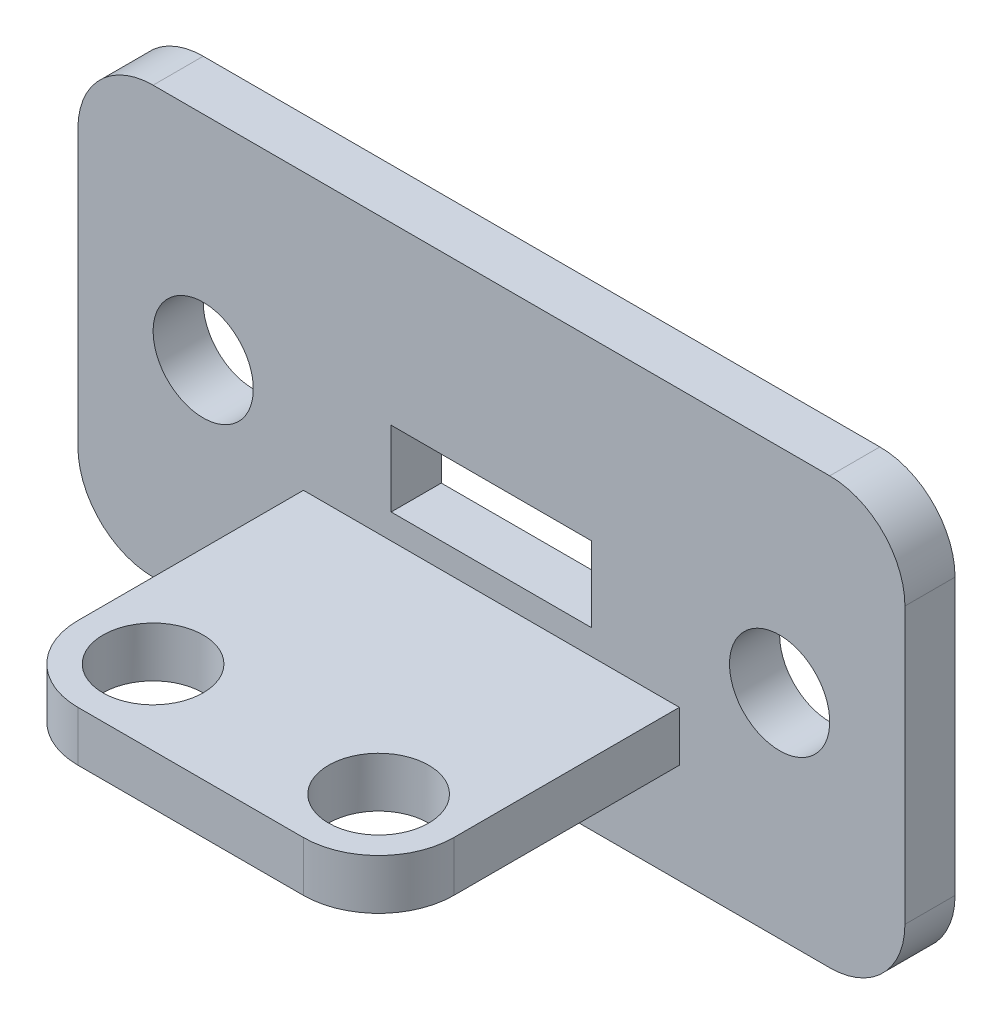
ISO-10303-21;
HEADER;
FILE_DESCRIPTION(('STEP AP214'),'2;1');
FILE_NAME('part.step','',(''),(''),'','','');
FILE_SCHEMA(('AUTOMOTIVE_DESIGN { 1 0 10303 214 1 1 1 1 }'));
ENDSEC;
DATA;
#1=APPLICATION_CONTEXT('core data for automotive mechanical design processes');
#2=APPLICATION_PROTOCOL_DEFINITION('international standard','automotive_design',2000,#1);
#3=PRODUCT_CONTEXT('',#1,'mechanical');
#4=PRODUCT('Part','Part','',(#3));
#5=PRODUCT_RELATED_PRODUCT_CATEGORY('part','',(#4));
#6=PRODUCT_DEFINITION_FORMATION('','',#4);
#7=PRODUCT_DEFINITION_CONTEXT('part definition',#1,'design');
#8=PRODUCT_DEFINITION('design','',#6,#7);
#9=PRODUCT_DEFINITION_SHAPE('','',#8);
#10=(LENGTH_UNIT() NAMED_UNIT(*) SI_UNIT(.MILLI.,.METRE.));
#11=(NAMED_UNIT(*) PLANE_ANGLE_UNIT() SI_UNIT($,.RADIAN.));
#12=(NAMED_UNIT(*) SI_UNIT($,.STERADIAN.) SOLID_ANGLE_UNIT());
#13=UNCERTAINTY_MEASURE_WITH_UNIT(LENGTH_MEASURE(1.E-05),#10,'distance_accuracy_value','');
#14=(GEOMETRIC_REPRESENTATION_CONTEXT(3) GLOBAL_UNCERTAINTY_ASSIGNED_CONTEXT((#13)) GLOBAL_UNIT_ASSIGNED_CONTEXT((#10,
#11,#12)) REPRESENTATION_CONTEXT('',''));
#15=CARTESIAN_POINT('',(0.,0.,0.));
#16=DIRECTION('',(0.,0.,1.));
#17=DIRECTION('',(1.,0.,0.));
#18=AXIS2_PLACEMENT_3D('',#15,#16,#17);
#19=CARTESIAN_POINT('',(7.5,2.,6.));
#20=DIRECTION('',(-1.,0.,0.));
#21=DIRECTION('',(0.,0.,1.));
#22=AXIS2_PLACEMENT_3D('',#19,#20,#21);
#23=PLANE('',#22);
#24=DIRECTION('',(0.,0.,-1.));
#25=VECTOR('',#24,1.);
#26=CARTESIAN_POINT('',(7.5,2.,6.));
#27=LINE('',#26,#25);
#28=CARTESIAN_POINT('',(7.5,2.,3.));
#29=VERTEX_POINT('',#28);
#30=CARTESIAN_POINT('',(7.5,2.,-6.));
#31=VERTEX_POINT('',#30);
#32=EDGE_CURVE('E239',#29,#31,#27,.T.);
#33=ORIENTED_EDGE('',*,*,#32,.F.);
#34=DIRECTION('',(0.,-1.,0.));
#35=VECTOR('',#34,1.);
#36=CARTESIAN_POINT('',(7.5,2.,3.));
#37=LINE('',#36,#35);
#38=CARTESIAN_POINT('',(7.5,0.,3.));
#39=VERTEX_POINT('',#38);
#40=EDGE_CURVE('E11',#29,#39,#37,.T.);
#41=ORIENTED_EDGE('',*,*,#40,.T.);
#42=DIRECTION('',(0.,0.,-1.));
#43=VECTOR('',#42,1.);
#44=CARTESIAN_POINT('',(7.5,0.,6.));
#45=LINE('',#44,#43);
#46=CARTESIAN_POINT('',(7.5,0.,-6.));
#47=VERTEX_POINT('',#46);
#48=EDGE_CURVE('E230',#39,#47,#45,.T.);
#49=ORIENTED_EDGE('',*,*,#48,.T.);
#50=DIRECTION('',(0.,-1.,0.));
#51=VECTOR('',#50,1.);
#52=CARTESIAN_POINT('',(7.5,2.,-6.));
#53=LINE('',#52,#51);
#54=EDGE_CURVE('E258',#31,#47,#53,.T.);
#55=ORIENTED_EDGE('',*,*,#54,.F.);
#56=EDGE_LOOP('',(#33,#41,#49,#55));
#57=FACE_BOUND('',#56,.T.);
#58=ADVANCED_FACE('F32',(#57),#23,.F.);
#59=CARTESIAN_POINT('',(-7.5,2.,6.));
#60=DIRECTION('',(1.,0.,0.));
#61=DIRECTION('',(0.,0.,-1.));
#62=AXIS2_PLACEMENT_3D('',#59,#60,#61);
#63=PLANE('',#62);
#64=DIRECTION('',(0.,0.,1.));
#65=VECTOR('',#64,1.);
#66=CARTESIAN_POINT('',(-7.5,0.,6.));
#67=LINE('',#66,#65);
#68=CARTESIAN_POINT('',(-7.5,0.,-6.));
#69=VERTEX_POINT('',#68);
#70=CARTESIAN_POINT('',(-7.5,0.,3.));
#71=VERTEX_POINT('',#70);
#72=EDGE_CURVE('E253',#69,#71,#67,.T.);
#73=ORIENTED_EDGE('',*,*,#72,.T.);
#74=DIRECTION('',(0.,-1.,0.));
#75=VECTOR('',#74,1.);
#76=CARTESIAN_POINT('',(-7.5,2.,3.));
#77=LINE('',#76,#75);
#78=CARTESIAN_POINT('',(-7.5,2.,3.));
#79=VERTEX_POINT('',#78);
#80=EDGE_CURVE('E55',#71,#79,#77,.F.);
#81=ORIENTED_EDGE('',*,*,#80,.T.);
#82=DIRECTION('',(0.,0.,1.));
#83=VECTOR('',#82,1.);
#84=CARTESIAN_POINT('',(-7.5,2.,6.));
#85=LINE('',#84,#83);
#86=CARTESIAN_POINT('',(-7.5,2.,-6.));
#87=VERTEX_POINT('',#86);
#88=EDGE_CURVE('E244',#87,#79,#85,.T.);
#89=ORIENTED_EDGE('',*,*,#88,.F.);
#90=DIRECTION('',(0.,-1.,0.));
#91=VECTOR('',#90,1.);
#92=CARTESIAN_POINT('',(-7.5,2.,-6.));
#93=LINE('',#92,#91);
#94=EDGE_CURVE('E248',#87,#69,#93,.T.);
#95=ORIENTED_EDGE('',*,*,#94,.T.);
#96=EDGE_LOOP('',(#73,#81,#89,#95));
#97=FACE_BOUND('',#96,.T.);
#98=ADVANCED_FACE('F321',(#97),#63,.F.);
#99=CARTESIAN_POINT('',(-7.5,2.,6.));
#100=DIRECTION('',(0.,0.,-1.));
#101=DIRECTION('',(-1.,0.,0.));
#102=AXIS2_PLACEMENT_3D('',#99,#100,#101);
#103=PLANE('',#102);
#104=DIRECTION('',(1.,0.,0.));
#105=VECTOR('',#104,1.);
#106=CARTESIAN_POINT('',(-7.5,2.,6.));
#107=LINE('',#106,#105);
#108=CARTESIAN_POINT('',(-4.5,2.,6.));
#109=VERTEX_POINT('',#108);
#110=CARTESIAN_POINT('',(4.5,2.,6.));
#111=VERTEX_POINT('',#110);
#112=EDGE_CURVE('E246',#109,#111,#107,.T.);
#113=ORIENTED_EDGE('',*,*,#112,.F.);
#114=DIRECTION('',(0.,-1.,0.));
#115=VECTOR('',#114,1.);
#116=CARTESIAN_POINT('',(-4.5,2.,6.));
#117=LINE('',#116,#115);
#118=CARTESIAN_POINT('',(-4.5,0.,6.));
#119=VERTEX_POINT('',#118);
#120=EDGE_CURVE('E299',#109,#119,#117,.T.);
#121=ORIENTED_EDGE('',*,*,#120,.T.);
#122=DIRECTION('',(1.,0.,0.));
#123=VECTOR('',#122,1.);
#124=CARTESIAN_POINT('',(-7.5,0.,6.));
#125=LINE('',#124,#123);
#126=CARTESIAN_POINT('',(4.5,0.,6.));
#127=VERTEX_POINT('',#126);
#128=EDGE_CURVE('E242',#119,#127,#125,.T.);
#129=ORIENTED_EDGE('',*,*,#128,.T.);
#130=DIRECTION('',(0.,-1.,0.));
#131=VECTOR('',#130,1.);
#132=CARTESIAN_POINT('',(4.5,2.,6.));
#133=LINE('',#132,#131);
#134=EDGE_CURVE('E297',#127,#111,#133,.F.);
#135=ORIENTED_EDGE('',*,*,#134,.T.);
#136=EDGE_LOOP('',(#113,#121,#129,#135));
#137=FACE_BOUND('',#136,.T.);
#138=ADVANCED_FACE('F313',(#137),#103,.F.);
#139=CARTESIAN_POINT('',(0.,2.,0.));
#140=DIRECTION('',(0.,-1.,0.));
#141=DIRECTION('',(0.,0.,-1.));
#142=AXIS2_PLACEMENT_3D('',#139,#140,#141);
#143=PLANE('',#142);
#144=CARTESIAN_POINT('',(-4.5,2.,3.));
#145=DIRECTION('',(0.,1.,0.));
#146=DIRECTION('',(0.,0.,1.));
#147=AXIS2_PLACEMENT_3D('',#144,#145,#146);
#148=CIRCLE('',#147,2.);
#149=CARTESIAN_POINT('',(-4.5,2.,5.));
#150=VERTEX_POINT('',#149);
#151=EDGE_CURVE('E227',#150,#150,#148,.T.);
#152=ORIENTED_EDGE('',*,*,#151,.F.);
#153=EDGE_LOOP('',(#152));
#154=FACE_BOUND('',#153,.T.);
#155=CARTESIAN_POINT('',(4.5,2.,3.));
#156=DIRECTION('',(0.,1.,0.));
#157=DIRECTION('',(0.,0.,1.));
#158=AXIS2_PLACEMENT_3D('',#155,#156,#157);
#159=CIRCLE('',#158,2.);
#160=CARTESIAN_POINT('',(4.5,2.,5.));
#161=VERTEX_POINT('',#160);
#162=EDGE_CURVE('E234',#161,#161,#159,.T.);
#163=ORIENTED_EDGE('',*,*,#162,.F.);
#164=EDGE_LOOP('',(#163));
#165=FACE_BOUND('',#164,.T.);
#166=ORIENTED_EDGE('',*,*,#88,.T.);
#167=CARTESIAN_POINT('',(-4.5,2.,3.));
#168=DIRECTION('',(0.,-1.,0.));
#169=DIRECTION('',(0.,0.,-1.));
#170=AXIS2_PLACEMENT_3D('',#167,#168,#169);
#171=CIRCLE('',#170,3.);
#172=EDGE_CURVE('E40',#79,#109,#171,.F.);
#173=ORIENTED_EDGE('',*,*,#172,.T.);
#174=ORIENTED_EDGE('',*,*,#112,.T.);
#175=CARTESIAN_POINT('',(4.5,2.,3.));
#176=DIRECTION('',(0.,-1.,0.));
#177=DIRECTION('',(0.,0.,-1.));
#178=AXIS2_PLACEMENT_3D('',#175,#176,#177);
#179=CIRCLE('',#178,3.);
#180=EDGE_CURVE('E47',#111,#29,#179,.F.);
#181=ORIENTED_EDGE('',*,*,#180,.T.);
#182=ORIENTED_EDGE('',*,*,#32,.T.);
#183=DIRECTION('',(-1.,0.,0.));
#184=VECTOR('',#183,1.);
#185=CARTESIAN_POINT('',(-7.5,2.,-6.));
#186=LINE('',#185,#184);
#187=EDGE_CURVE('E241',#31,#87,#186,.T.);
#188=ORIENTED_EDGE('',*,*,#187,.T.);
#189=EDGE_LOOP('',(#166,#173,#174,#181,#182,#188));
#190=FACE_BOUND('',#189,.T.);
#191=ADVANCED_FACE('F309',(#154,#165,#190),#143,.F.);
#192=CARTESIAN_POINT('',(0.,0.,0.));
#193=DIRECTION('',(0.,-1.,0.));
#194=DIRECTION('',(0.,0.,-1.));
#195=AXIS2_PLACEMENT_3D('',#192,#193,#194);
#196=PLANE('',#195);
#197=CARTESIAN_POINT('',(-4.5,0.,3.));
#198=DIRECTION('',(0.,-1.,0.));
#199=DIRECTION('',(0.,0.,-1.));
#200=AXIS2_PLACEMENT_3D('',#197,#198,#199);
#201=CIRCLE('',#200,2.);
#202=CARTESIAN_POINT('',(-4.5,0.,0.999999999999998));
#203=VERTEX_POINT('',#202);
#204=EDGE_CURVE('E231',#203,#203,#201,.F.);
#205=ORIENTED_EDGE('',*,*,#204,.T.);
#206=EDGE_LOOP('',(#205));
#207=FACE_BOUND('',#206,.T.);
#208=CARTESIAN_POINT('',(4.5,0.,3.));
#209=DIRECTION('',(0.,-1.,0.));
#210=DIRECTION('',(0.,0.,-1.));
#211=AXIS2_PLACEMENT_3D('',#208,#209,#210);
#212=CIRCLE('',#211,2.);
#213=CARTESIAN_POINT('',(4.5,0.,0.999999999999998));
#214=VERTEX_POINT('',#213);
#215=EDGE_CURVE('E216',#214,#214,#212,.F.);
#216=ORIENTED_EDGE('',*,*,#215,.T.);
#217=EDGE_LOOP('',(#216));
#218=FACE_BOUND('',#217,.T.);
#219=ORIENTED_EDGE('',*,*,#128,.F.);
#220=CARTESIAN_POINT('',(-4.5,0.,3.));
#221=DIRECTION('',(0.,-1.,0.));
#222=DIRECTION('',(0.,0.,-1.));
#223=AXIS2_PLACEMENT_3D('',#220,#221,#222);
#224=CIRCLE('',#223,3.);
#225=EDGE_CURVE('E304',#119,#71,#224,.T.);
#226=ORIENTED_EDGE('',*,*,#225,.T.);
#227=ORIENTED_EDGE('',*,*,#72,.F.);
#228=DIRECTION('',(-1.,0.,0.));
#229=VECTOR('',#228,1.);
#230=CARTESIAN_POINT('',(-7.5,0.,-6.));
#231=LINE('',#230,#229);
#232=EDGE_CURVE('E250',#47,#69,#231,.T.);
#233=ORIENTED_EDGE('',*,*,#232,.F.);
#234=ORIENTED_EDGE('',*,*,#48,.F.);
#235=CARTESIAN_POINT('',(4.5,0.,3.));
#236=DIRECTION('',(0.,-1.,0.));
#237=DIRECTION('',(0.,0.,-1.));
#238=AXIS2_PLACEMENT_3D('',#235,#236,#237);
#239=CIRCLE('',#238,3.);
#240=EDGE_CURVE('E302',#39,#127,#239,.T.);
#241=ORIENTED_EDGE('',*,*,#240,.T.);
#242=EDGE_LOOP('',(#219,#226,#227,#233,#234,#241));
#243=FACE_BOUND('',#242,.T.);
#244=ADVANCED_FACE('F319',(#207,#218,#243),#196,.T.);
#245=CARTESIAN_POINT('',(4.5,-0.00100000000000013,3.));
#246=DIRECTION('',(0.,1.,0.));
#247=DIRECTION('',(0.,0.,1.));
#248=AXIS2_PLACEMENT_3D('',#245,#246,#247);
#249=CYLINDRICAL_SURFACE('',#248,2.);
#250=ORIENTED_EDGE('',*,*,#215,.F.);
#251=EDGE_LOOP('',(#250));
#252=FACE_BOUND('',#251,.T.);
#253=ORIENTED_EDGE('',*,*,#162,.T.);
#254=EDGE_LOOP('',(#253));
#255=FACE_BOUND('',#254,.T.);
#256=ADVANCED_FACE('F399',(#252,#255),#249,.F.);
#257=CARTESIAN_POINT('',(-4.5,-0.00100000000000013,3.));
#258=DIRECTION('',(0.,1.,0.));
#259=DIRECTION('',(0.,0.,1.));
#260=AXIS2_PLACEMENT_3D('',#257,#258,#259);
#261=CYLINDRICAL_SURFACE('',#260,2.);
#262=ORIENTED_EDGE('',*,*,#204,.F.);
#263=EDGE_LOOP('',(#262));
#264=FACE_BOUND('',#263,.T.);
#265=ORIENTED_EDGE('',*,*,#151,.T.);
#266=EDGE_LOOP('',(#265));
#267=FACE_BOUND('',#266,.T.);
#268=ADVANCED_FACE('F391',(#264,#267),#261,.F.);
#269=CARTESIAN_POINT('',(0.,0.,-6.));
#270=DIRECTION('',(0.,0.,-1.));
#271=DIRECTION('',(-1.,0.,0.));
#272=AXIS2_PLACEMENT_3D('',#269,#270,#271);
#273=PLANE('',#272);
#274=CARTESIAN_POINT('',(11.5,4.5,-6.));
#275=DIRECTION('',(0.,0.,-1.));
#276=DIRECTION('',(-1.,0.,0.));
#277=AXIS2_PLACEMENT_3D('',#274,#275,#276);
#278=CIRCLE('',#277,2.);
#279=CARTESIAN_POINT('',(9.5,4.5,-6.));
#280=VERTEX_POINT('',#279);
#281=EDGE_CURVE('E596',#280,#280,#278,.F.);
#282=ORIENTED_EDGE('',*,*,#281,.F.);
#283=EDGE_LOOP('',(#282));
#284=FACE_BOUND('',#283,.T.);
#285=CARTESIAN_POINT('',(-11.5,4.5,-6.));
#286=DIRECTION('',(0.,0.,-1.));
#287=DIRECTION('',(-1.,0.,0.));
#288=AXIS2_PLACEMENT_3D('',#285,#286,#287);
#289=CIRCLE('',#288,2.);
#290=CARTESIAN_POINT('',(-13.5,4.5,-6.));
#291=VERTEX_POINT('',#290);
#292=EDGE_CURVE('E591',#291,#291,#289,.F.);
#293=ORIENTED_EDGE('',*,*,#292,.F.);
#294=EDGE_LOOP('',(#293));
#295=FACE_BOUND('',#294,.T.);
#296=DIRECTION('',(-1.,0.,0.));
#297=VECTOR('',#296,1.);
#298=CARTESIAN_POINT('',(-4.,6.,-6.));
#299=LINE('',#298,#297);
#300=CARTESIAN_POINT('',(4.,6.,-6.));
#301=VERTEX_POINT('',#300);
#302=CARTESIAN_POINT('',(-4.,6.,-6.));
#303=VERTEX_POINT('',#302);
#304=EDGE_CURVE('E187',#301,#303,#299,.T.);
#305=ORIENTED_EDGE('',*,*,#304,.F.);
#306=DIRECTION('',(0.,1.,0.));
#307=VECTOR('',#306,1.);
#308=CARTESIAN_POINT('',(4.,3.,-6.));
#309=LINE('',#308,#307);
#310=CARTESIAN_POINT('',(4.,3.,-6.));
#311=VERTEX_POINT('',#310);
#312=EDGE_CURVE('E179',#311,#301,#309,.T.);
#313=ORIENTED_EDGE('',*,*,#312,.F.);
#314=DIRECTION('',(1.,0.,0.));
#315=VECTOR('',#314,1.);
#316=CARTESIAN_POINT('',(-4.,3.,-6.));
#317=LINE('',#316,#315);
#318=CARTESIAN_POINT('',(-4.,3.,-6.));
#319=VERTEX_POINT('',#318);
#320=EDGE_CURVE('E180',#319,#311,#317,.T.);
#321=ORIENTED_EDGE('',*,*,#320,.F.);
#322=DIRECTION('',(0.,-1.,0.));
#323=VECTOR('',#322,1.);
#324=CARTESIAN_POINT('',(-4.,3.,-6.));
#325=LINE('',#324,#323);
#326=EDGE_CURVE('E194',#303,#319,#325,.T.);
#327=ORIENTED_EDGE('',*,*,#326,.F.);
#328=EDGE_LOOP('',(#305,#313,#321,#327));
#329=FACE_BOUND('',#328,.T.);
#330=DIRECTION('',(-1.,0.,0.));
#331=VECTOR('',#330,1.);
#332=CARTESIAN_POINT('',(16.5,-4.,-6.));
#333=LINE('',#332,#331);
#334=CARTESIAN_POINT('',(13.5,-4.,-6.));
#335=VERTEX_POINT('',#334);
#336=CARTESIAN_POINT('',(-13.5,-4.,-6.));
#337=VERTEX_POINT('',#336);
#338=EDGE_CURVE('E219',#335,#337,#333,.T.);
#339=ORIENTED_EDGE('',*,*,#338,.F.);
#340=CARTESIAN_POINT('',(13.5,-1.,-6.));
#341=DIRECTION('',(0.,0.,-1.));
#342=DIRECTION('',(-1.,0.,0.));
#343=AXIS2_PLACEMENT_3D('',#340,#341,#342);
#344=CIRCLE('',#343,3.);
#345=CARTESIAN_POINT('',(16.5,-0.999999999999999,-6.));
#346=VERTEX_POINT('',#345);
#347=EDGE_CURVE('E272',#335,#346,#344,.F.);
#348=ORIENTED_EDGE('',*,*,#347,.T.);
#349=DIRECTION('',(0.,-1.,0.));
#350=VECTOR('',#349,1.);
#351=CARTESIAN_POINT('',(16.5,13.,-6.));
#352=LINE('',#351,#350);
#353=CARTESIAN_POINT('',(16.5,10.,-6.));
#354=VERTEX_POINT('',#353);
#355=EDGE_CURVE('E171',#354,#346,#352,.T.);
#356=ORIENTED_EDGE('',*,*,#355,.F.);
#357=CARTESIAN_POINT('',(13.5,10.,-6.));
#358=DIRECTION('',(0.,0.,-1.));
#359=DIRECTION('',(-1.,0.,0.));
#360=AXIS2_PLACEMENT_3D('',#357,#358,#359);
#361=CIRCLE('',#360,3.);
#362=CARTESIAN_POINT('',(13.5,13.,-6.));
#363=VERTEX_POINT('',#362);
#364=EDGE_CURVE('E266',#354,#363,#361,.F.);
#365=ORIENTED_EDGE('',*,*,#364,.T.);
#366=DIRECTION('',(1.,0.,0.));
#367=VECTOR('',#366,1.);
#368=CARTESIAN_POINT('',(16.5,13.,-6.));
#369=LINE('',#368,#367);
#370=CARTESIAN_POINT('',(-13.5,13.,-6.));
#371=VERTEX_POINT('',#370);
#372=EDGE_CURVE('E207',#371,#363,#369,.T.);
#373=ORIENTED_EDGE('',*,*,#372,.F.);
#374=CARTESIAN_POINT('',(-13.5,10.,-6.));
#375=DIRECTION('',(0.,0.,-1.));
#376=DIRECTION('',(-1.,0.,0.));
#377=AXIS2_PLACEMENT_3D('',#374,#375,#376);
#378=CIRCLE('',#377,3.);
#379=CARTESIAN_POINT('',(-16.5,10.,-6.));
#380=VERTEX_POINT('',#379);
#381=EDGE_CURVE('E268',#371,#380,#378,.F.);
#382=ORIENTED_EDGE('',*,*,#381,.T.);
#383=DIRECTION('',(0.,1.,0.));
#384=VECTOR('',#383,1.);
#385=CARTESIAN_POINT('',(-16.5,13.,-6.));
#386=LINE('',#385,#384);
#387=CARTESIAN_POINT('',(-16.5,-1.,-6.));
#388=VERTEX_POINT('',#387);
#389=EDGE_CURVE('E222',#388,#380,#386,.T.);
#390=ORIENTED_EDGE('',*,*,#389,.F.);
#391=CARTESIAN_POINT('',(-13.5,-1.,-6.));
#392=DIRECTION('',(0.,0.,-1.));
#393=DIRECTION('',(-1.,0.,0.));
#394=AXIS2_PLACEMENT_3D('',#391,#392,#393);
#395=CIRCLE('',#394,3.);
#396=EDGE_CURVE('E270',#388,#337,#395,.F.);
#397=ORIENTED_EDGE('',*,*,#396,.T.);
#398=EDGE_LOOP('',(#339,#348,#356,#365,#373,#382,#390,#397));
#399=FACE_BOUND('',#398,.T.);
#400=ORIENTED_EDGE('',*,*,#54,.T.);
#401=ORIENTED_EDGE('',*,*,#232,.T.);
#402=ORIENTED_EDGE('',*,*,#94,.F.);
#403=ORIENTED_EDGE('',*,*,#187,.F.);
#404=EDGE_LOOP('',(#400,#401,#402,#403));
#405=FACE_BOUND('',#404,.T.);
#406=ADVANCED_FACE('F325',(#284,#295,#329,#399,#405),#273,.F.);
#407=CARTESIAN_POINT('',(16.5,13.,-8.));
#408=DIRECTION('',(-1.,0.,0.));
#409=DIRECTION('',(0.,-1.,0.));
#410=AXIS2_PLACEMENT_3D('',#407,#408,#409);
#411=PLANE('',#410);
#412=ORIENTED_EDGE('',*,*,#355,.T.);
#413=DIRECTION('',(0.,0.,1.));
#414=VECTOR('',#413,1.);
#415=CARTESIAN_POINT('',(16.5,-0.999999999999999,-8.));
#416=LINE('',#415,#414);
#417=CARTESIAN_POINT('',(16.5,-0.999999999999999,-8.));
#418=VERTEX_POINT('',#417);
#419=EDGE_CURVE('E277',#346,#418,#416,.F.);
#420=ORIENTED_EDGE('',*,*,#419,.T.);
#421=DIRECTION('',(0.,-1.,0.));
#422=VECTOR('',#421,1.);
#423=CARTESIAN_POINT('',(16.5,13.,-8.));
#424=LINE('',#423,#422);
#425=CARTESIAN_POINT('',(16.5,10.,-8.));
#426=VERTEX_POINT('',#425);
#427=EDGE_CURVE('E203',#426,#418,#424,.T.);
#428=ORIENTED_EDGE('',*,*,#427,.F.);
#429=DIRECTION('',(0.,0.,1.));
#430=VECTOR('',#429,1.);
#431=CARTESIAN_POINT('',(16.5,10.,-8.));
#432=LINE('',#431,#430);
#433=EDGE_CURVE('E274',#426,#354,#432,.T.);
#434=ORIENTED_EDGE('',*,*,#433,.T.);
#435=EDGE_LOOP('',(#412,#420,#428,#434));
#436=FACE_BOUND('',#435,.T.);
#437=ADVANCED_FACE('F368',(#436),#411,.F.);
#438=CARTESIAN_POINT('',(16.5,-4.,-8.));
#439=DIRECTION('',(0.,1.,0.));
#440=DIRECTION('',(0.,0.,1.));
#441=AXIS2_PLACEMENT_3D('',#438,#439,#440);
#442=PLANE('',#441);
#443=DIRECTION('',(-1.,0.,0.));
#444=VECTOR('',#443,1.);
#445=CARTESIAN_POINT('',(16.5,-4.,-8.));
#446=LINE('',#445,#444);
#447=CARTESIAN_POINT('',(13.5,-4.,-8.));
#448=VERTEX_POINT('',#447);
#449=CARTESIAN_POINT('',(-13.5,-4.,-8.));
#450=VERTEX_POINT('',#449);
#451=EDGE_CURVE('E206',#448,#450,#446,.T.);
#452=ORIENTED_EDGE('',*,*,#451,.F.);
#453=DIRECTION('',(0.,0.,1.));
#454=VECTOR('',#453,1.);
#455=CARTESIAN_POINT('',(13.5,-4.,-8.));
#456=LINE('',#455,#454);
#457=EDGE_CURVE('E263',#448,#335,#456,.T.);
#458=ORIENTED_EDGE('',*,*,#457,.T.);
#459=ORIENTED_EDGE('',*,*,#338,.T.);
#460=DIRECTION('',(0.,0.,1.));
#461=VECTOR('',#460,1.);
#462=CARTESIAN_POINT('',(-13.5,-4.,-8.));
#463=LINE('',#462,#461);
#464=EDGE_CURVE('E261',#337,#450,#463,.F.);
#465=ORIENTED_EDGE('',*,*,#464,.T.);
#466=EDGE_LOOP('',(#452,#458,#459,#465));
#467=FACE_BOUND('',#466,.T.);
#468=ADVANCED_FACE('F375',(#467),#442,.F.);
#469=CARTESIAN_POINT('',(-16.5,13.,-8.));
#470=DIRECTION('',(1.,0.,0.));
#471=DIRECTION('',(0.,1.,0.));
#472=AXIS2_PLACEMENT_3D('',#469,#470,#471);
#473=PLANE('',#472);
#474=DIRECTION('',(0.,1.,0.));
#475=VECTOR('',#474,1.);
#476=CARTESIAN_POINT('',(-16.5,13.,-8.));
#477=LINE('',#476,#475);
#478=CARTESIAN_POINT('',(-16.5,-1.,-8.));
#479=VERTEX_POINT('',#478);
#480=CARTESIAN_POINT('',(-16.5,10.,-8.));
#481=VERTEX_POINT('',#480);
#482=EDGE_CURVE('E210',#479,#481,#477,.T.);
#483=ORIENTED_EDGE('',*,*,#482,.F.);
#484=DIRECTION('',(0.,0.,1.));
#485=VECTOR('',#484,1.);
#486=CARTESIAN_POINT('',(-16.5,-1.,-8.));
#487=LINE('',#486,#485);
#488=EDGE_CURVE('E289',#479,#388,#487,.T.);
#489=ORIENTED_EDGE('',*,*,#488,.T.);
#490=ORIENTED_EDGE('',*,*,#389,.T.);
#491=DIRECTION('',(0.,0.,1.));
#492=VECTOR('',#491,1.);
#493=CARTESIAN_POINT('',(-16.5,10.,-8.));
#494=LINE('',#493,#492);
#495=EDGE_CURVE('E287',#380,#481,#494,.F.);
#496=ORIENTED_EDGE('',*,*,#495,.T.);
#497=EDGE_LOOP('',(#483,#489,#490,#496));
#498=FACE_BOUND('',#497,.T.);
#499=ADVANCED_FACE('F382',(#498),#473,.F.);
#500=CARTESIAN_POINT('',(16.5,13.,-8.));
#501=DIRECTION('',(0.,-1.,0.));
#502=DIRECTION('',(0.,0.,-1.));
#503=AXIS2_PLACEMENT_3D('',#500,#501,#502);
#504=PLANE('',#503);
#505=DIRECTION('',(1.,0.,0.));
#506=VECTOR('',#505,1.);
#507=CARTESIAN_POINT('',(16.5,13.,-8.));
#508=LINE('',#507,#506);
#509=CARTESIAN_POINT('',(-13.5,13.,-8.));
#510=VERTEX_POINT('',#509);
#511=CARTESIAN_POINT('',(13.5,13.,-8.));
#512=VERTEX_POINT('',#511);
#513=EDGE_CURVE('E213',#510,#512,#508,.T.);
#514=ORIENTED_EDGE('',*,*,#513,.F.);
#515=DIRECTION('',(0.,0.,1.));
#516=VECTOR('',#515,1.);
#517=CARTESIAN_POINT('',(-13.5,13.,-8.));
#518=LINE('',#517,#516);
#519=EDGE_CURVE('E294',#510,#371,#518,.T.);
#520=ORIENTED_EDGE('',*,*,#519,.T.);
#521=ORIENTED_EDGE('',*,*,#372,.T.);
#522=DIRECTION('',(0.,0.,1.));
#523=VECTOR('',#522,1.);
#524=CARTESIAN_POINT('',(13.5,13.,-8.));
#525=LINE('',#524,#523);
#526=EDGE_CURVE('E292',#363,#512,#525,.F.);
#527=ORIENTED_EDGE('',*,*,#526,.T.);
#528=EDGE_LOOP('',(#514,#520,#521,#527));
#529=FACE_BOUND('',#528,.T.);
#530=ADVANCED_FACE('F387',(#529),#504,.F.);
#531=CARTESIAN_POINT('',(0.,0.,-8.));
#532=DIRECTION('',(0.,0.,-1.));
#533=DIRECTION('',(-1.,0.,0.));
#534=AXIS2_PLACEMENT_3D('',#531,#532,#533);
#535=PLANE('',#534);
#536=CARTESIAN_POINT('',(11.5,4.5,-8.));
#537=DIRECTION('',(0.,0.,-1.));
#538=DIRECTION('',(-1.,0.,0.));
#539=AXIS2_PLACEMENT_3D('',#536,#537,#538);
#540=CIRCLE('',#539,2.);
#541=CARTESIAN_POINT('',(9.5,4.5,-8.));
#542=VERTEX_POINT('',#541);
#543=EDGE_CURVE('E587',#542,#542,#540,.T.);
#544=ORIENTED_EDGE('',*,*,#543,.F.);
#545=EDGE_LOOP('',(#544));
#546=FACE_BOUND('',#545,.T.);
#547=CARTESIAN_POINT('',(-11.5,4.5,-8.));
#548=DIRECTION('',(0.,0.,-1.));
#549=DIRECTION('',(-1.,0.,0.));
#550=AXIS2_PLACEMENT_3D('',#547,#548,#549);
#551=CIRCLE('',#550,2.);
#552=CARTESIAN_POINT('',(-13.5,4.5,-8.));
#553=VERTEX_POINT('',#552);
#554=EDGE_CURVE('E590',#553,#553,#551,.T.);
#555=ORIENTED_EDGE('',*,*,#554,.F.);
#556=EDGE_LOOP('',(#555));
#557=FACE_BOUND('',#556,.T.);
#558=DIRECTION('',(0.,1.,0.));
#559=VECTOR('',#558,1.);
#560=CARTESIAN_POINT('',(4.,3.,-8.));
#561=LINE('',#560,#559);
#562=CARTESIAN_POINT('',(4.,3.,-8.));
#563=VERTEX_POINT('',#562);
#564=CARTESIAN_POINT('',(4.,6.,-8.));
#565=VERTEX_POINT('',#564);
#566=EDGE_CURVE('E176',#563,#565,#561,.T.);
#567=ORIENTED_EDGE('',*,*,#566,.T.);
#568=DIRECTION('',(-1.,0.,0.));
#569=VECTOR('',#568,1.);
#570=CARTESIAN_POINT('',(-4.,6.,-8.));
#571=LINE('',#570,#569);
#572=CARTESIAN_POINT('',(-4.,6.,-8.));
#573=VERTEX_POINT('',#572);
#574=EDGE_CURVE('E160',#565,#573,#571,.T.);
#575=ORIENTED_EDGE('',*,*,#574,.T.);
#576=DIRECTION('',(0.,-1.,0.));
#577=VECTOR('',#576,1.);
#578=CARTESIAN_POINT('',(-4.,3.,-8.));
#579=LINE('',#578,#577);
#580=CARTESIAN_POINT('',(-4.,3.,-8.));
#581=VERTEX_POINT('',#580);
#582=EDGE_CURVE('E189',#573,#581,#579,.T.);
#583=ORIENTED_EDGE('',*,*,#582,.T.);
#584=DIRECTION('',(1.,0.,0.));
#585=VECTOR('',#584,1.);
#586=CARTESIAN_POINT('',(-4.,3.,-8.));
#587=LINE('',#586,#585);
#588=EDGE_CURVE('E185',#581,#563,#587,.T.);
#589=ORIENTED_EDGE('',*,*,#588,.T.);
#590=EDGE_LOOP('',(#567,#575,#583,#589));
#591=FACE_BOUND('',#590,.T.);
#592=ORIENTED_EDGE('',*,*,#427,.T.);
#593=CARTESIAN_POINT('',(13.5,-1.,-8.));
#594=DIRECTION('',(0.,0.,-1.));
#595=DIRECTION('',(-1.,0.,0.));
#596=AXIS2_PLACEMENT_3D('',#593,#594,#595);
#597=CIRCLE('',#596,3.);
#598=EDGE_CURVE('E285',#418,#448,#597,.T.);
#599=ORIENTED_EDGE('',*,*,#598,.T.);
#600=ORIENTED_EDGE('',*,*,#451,.T.);
#601=CARTESIAN_POINT('',(-13.5,-1.,-8.));
#602=DIRECTION('',(0.,0.,-1.));
#603=DIRECTION('',(-1.,0.,0.));
#604=AXIS2_PLACEMENT_3D('',#601,#602,#603);
#605=CIRCLE('',#604,3.);
#606=EDGE_CURVE('E283',#450,#479,#605,.T.);
#607=ORIENTED_EDGE('',*,*,#606,.T.);
#608=ORIENTED_EDGE('',*,*,#482,.T.);
#609=CARTESIAN_POINT('',(-13.5,10.,-8.));
#610=DIRECTION('',(0.,0.,-1.));
#611=DIRECTION('',(-1.,0.,0.));
#612=AXIS2_PLACEMENT_3D('',#609,#610,#611);
#613=CIRCLE('',#612,3.);
#614=EDGE_CURVE('E281',#481,#510,#613,.T.);
#615=ORIENTED_EDGE('',*,*,#614,.T.);
#616=ORIENTED_EDGE('',*,*,#513,.T.);
#617=CARTESIAN_POINT('',(13.5,10.,-8.));
#618=DIRECTION('',(0.,0.,-1.));
#619=DIRECTION('',(-1.,0.,0.));
#620=AXIS2_PLACEMENT_3D('',#617,#618,#619);
#621=CIRCLE('',#620,3.);
#622=EDGE_CURVE('E279',#512,#426,#621,.T.);
#623=ORIENTED_EDGE('',*,*,#622,.T.);
#624=EDGE_LOOP('',(#592,#599,#600,#607,#608,#615,#616,#623));
#625=FACE_BOUND('',#624,.T.);
#626=ADVANCED_FACE('F183',(#546,#557,#591,#625),#535,.T.);
#627=CARTESIAN_POINT('',(4.,3.,-8.001));
#628=DIRECTION('',(1.,0.,0.));
#629=DIRECTION('',(0.,0.,-1.));
#630=AXIS2_PLACEMENT_3D('',#627,#628,#629);
#631=PLANE('',#630);
#632=DIRECTION('',(0.,0.,1.));
#633=VECTOR('',#632,1.);
#634=CARTESIAN_POINT('',(4.,3.,-8.001));
#635=LINE('',#634,#633);
#636=EDGE_CURVE('E172',#563,#311,#635,.T.);
#637=ORIENTED_EDGE('',*,*,#636,.T.);
#638=ORIENTED_EDGE('',*,*,#312,.T.);
#639=DIRECTION('',(0.,0.,1.));
#640=VECTOR('',#639,1.);
#641=CARTESIAN_POINT('',(4.,6.,-8.001));
#642=LINE('',#641,#640);
#643=EDGE_CURVE('E164',#565,#301,#642,.T.);
#644=ORIENTED_EDGE('',*,*,#643,.F.);
#645=ORIENTED_EDGE('',*,*,#566,.F.);
#646=EDGE_LOOP('',(#637,#638,#644,#645));
#647=FACE_BOUND('',#646,.T.);
#648=ADVANCED_FACE('F175',(#647),#631,.F.);
#649=CARTESIAN_POINT('',(-4.,3.,-8.001));
#650=DIRECTION('',(0.,-1.,0.));
#651=DIRECTION('',(0.,0.,-1.));
#652=AXIS2_PLACEMENT_3D('',#649,#650,#651);
#653=PLANE('',#652);
#654=DIRECTION('',(0.,0.,1.));
#655=VECTOR('',#654,1.);
#656=CARTESIAN_POINT('',(-4.,3.,-8.001));
#657=LINE('',#656,#655);
#658=EDGE_CURVE('E200',#581,#319,#657,.T.);
#659=ORIENTED_EDGE('',*,*,#658,.T.);
#660=ORIENTED_EDGE('',*,*,#320,.T.);
#661=ORIENTED_EDGE('',*,*,#636,.F.);
#662=ORIENTED_EDGE('',*,*,#588,.F.);
#663=EDGE_LOOP('',(#659,#660,#661,#662));
#664=FACE_BOUND('',#663,.T.);
#665=ADVANCED_FACE('F453',(#664),#653,.F.);
#666=CARTESIAN_POINT('',(-4.,3.,-8.001));
#667=DIRECTION('',(-1.,0.,0.));
#668=DIRECTION('',(0.,0.,1.));
#669=AXIS2_PLACEMENT_3D('',#666,#667,#668);
#670=PLANE('',#669);
#671=DIRECTION('',(0.,0.,1.));
#672=VECTOR('',#671,1.);
#673=CARTESIAN_POINT('',(-4.,6.,-8.001));
#674=LINE('',#673,#672);
#675=EDGE_CURVE('E166',#573,#303,#674,.T.);
#676=ORIENTED_EDGE('',*,*,#675,.T.);
#677=ORIENTED_EDGE('',*,*,#326,.T.);
#678=ORIENTED_EDGE('',*,*,#658,.F.);
#679=ORIENTED_EDGE('',*,*,#582,.F.);
#680=EDGE_LOOP('',(#676,#677,#678,#679));
#681=FACE_BOUND('',#680,.T.);
#682=ADVANCED_FACE('F463',(#681),#670,.F.);
#683=CARTESIAN_POINT('',(-4.,6.,-8.001));
#684=DIRECTION('',(0.,1.,0.));
#685=DIRECTION('',(0.,0.,1.));
#686=AXIS2_PLACEMENT_3D('',#683,#684,#685);
#687=PLANE('',#686);
#688=ORIENTED_EDGE('',*,*,#643,.T.);
#689=ORIENTED_EDGE('',*,*,#304,.T.);
#690=ORIENTED_EDGE('',*,*,#675,.F.);
#691=ORIENTED_EDGE('',*,*,#574,.F.);
#692=EDGE_LOOP('',(#688,#689,#690,#691));
#693=FACE_BOUND('',#692,.T.);
#694=ADVANCED_FACE('F162',(#693),#687,.F.);
#695=CARTESIAN_POINT('',(-11.5,4.5,6.001));
#696=DIRECTION('',(0.,0.,-1.));
#697=DIRECTION('',(-1.,0.,0.));
#698=AXIS2_PLACEMENT_3D('',#695,#696,#697);
#699=CYLINDRICAL_SURFACE('',#698,2.);
#700=CARTESIAN_POINT('',(-13.5,4.5,-8.));
#701=CARTESIAN_POINT('',(-13.5,4.5,-7.97916666666667));
#702=CARTESIAN_POINT('',(-13.5,4.5,-7.95833333333333));
#703=CARTESIAN_POINT('',(-13.5,4.5,-7.91666666666667));
#704=CARTESIAN_POINT('',(-13.5,4.5,-7.89583333333333));
#705=CARTESIAN_POINT('',(-13.5,4.5,-7.85416666666667));
#706=CARTESIAN_POINT('',(-13.5,4.5,-7.83333333333333));
#707=CARTESIAN_POINT('',(-13.5,4.5,-7.79166666666666));
#708=CARTESIAN_POINT('',(-13.5,4.5,-7.77083333333333));
#709=CARTESIAN_POINT('',(-13.5,4.5,-7.72916666666666));
#710=CARTESIAN_POINT('',(-13.5,4.5,-7.70833333333333));
#711=CARTESIAN_POINT('',(-13.5,4.5,-7.66666666666666));
#712=CARTESIAN_POINT('',(-13.5,4.5,-7.64583333333333));
#713=CARTESIAN_POINT('',(-13.5,4.5,-7.60416666666666));
#714=CARTESIAN_POINT('',(-13.5,4.5,-7.58333333333333));
#715=CARTESIAN_POINT('',(-13.5,4.5,-7.54166666666666));
#716=CARTESIAN_POINT('',(-13.5,4.5,-7.52083333333333));
#717=CARTESIAN_POINT('',(-13.5,4.5,-7.47916666666667));
#718=CARTESIAN_POINT('',(-13.5,4.5,-7.45833333333333));
#719=CARTESIAN_POINT('',(-13.5,4.5,-7.41666666666667));
#720=CARTESIAN_POINT('',(-13.5,4.5,-7.39583333333333));
#721=CARTESIAN_POINT('',(-13.5,4.5,-7.35416666666667));
#722=CARTESIAN_POINT('',(-13.5,4.5,-7.33333333333333));
#723=CARTESIAN_POINT('',(-13.5,4.5,-7.29166666666667));
#724=CARTESIAN_POINT('',(-13.5,4.5,-7.27083333333333));
#725=CARTESIAN_POINT('',(-13.5,4.5,-7.22916666666667));
#726=CARTESIAN_POINT('',(-13.5,4.5,-7.20833333333333));
#727=CARTESIAN_POINT('',(-13.5,4.5,-7.16666666666667));
#728=CARTESIAN_POINT('',(-13.5,4.5,-7.14583333333333));
#729=CARTESIAN_POINT('',(-13.5,4.5,-7.10416666666667));
#730=CARTESIAN_POINT('',(-13.5,4.5,-7.08333333333333));
#731=CARTESIAN_POINT('',(-13.5,4.5,-7.04166666666667));
#732=CARTESIAN_POINT('',(-13.5,4.5,-7.02083333333333));
#733=CARTESIAN_POINT('',(-13.5,4.5,-6.97916666666667));
#734=CARTESIAN_POINT('',(-13.5,4.5,-6.95833333333333));
#735=CARTESIAN_POINT('',(-13.5,4.5,-6.91666666666667));
#736=CARTESIAN_POINT('',(-13.5,4.5,-6.89583333333333));
#737=CARTESIAN_POINT('',(-13.5,4.5,-6.85416666666667));
#738=CARTESIAN_POINT('',(-13.5,4.5,-6.83333333333333));
#739=CARTESIAN_POINT('',(-13.5,4.5,-6.79166666666667));
#740=CARTESIAN_POINT('',(-13.5,4.5,-6.77083333333333));
#741=CARTESIAN_POINT('',(-13.5,4.5,-6.72916666666667));
#742=CARTESIAN_POINT('',(-13.5,4.5,-6.70833333333333));
#743=CARTESIAN_POINT('',(-13.5,4.5,-6.66666666666667));
#744=CARTESIAN_POINT('',(-13.5,4.5,-6.64583333333333));
#745=CARTESIAN_POINT('',(-13.5,4.5,-6.60416666666667));
#746=CARTESIAN_POINT('',(-13.5,4.5,-6.58333333333333));
#747=CARTESIAN_POINT('',(-13.5,4.5,-6.54166666666667));
#748=CARTESIAN_POINT('',(-13.5,4.5,-6.52083333333333));
#749=CARTESIAN_POINT('',(-13.5,4.5,-6.47916666666667));
#750=CARTESIAN_POINT('',(-13.5,4.5,-6.45833333333333));
#751=CARTESIAN_POINT('',(-13.5,4.5,-6.41666666666667));
#752=CARTESIAN_POINT('',(-13.5,4.5,-6.39583333333333));
#753=CARTESIAN_POINT('',(-13.5,4.5,-6.35416666666667));
#754=CARTESIAN_POINT('',(-13.5,4.5,-6.33333333333333));
#755=CARTESIAN_POINT('',(-13.5,4.5,-6.29166666666667));
#756=CARTESIAN_POINT('',(-13.5,4.5,-6.27083333333333));
#757=CARTESIAN_POINT('',(-13.5,4.5,-6.22916666666667));
#758=CARTESIAN_POINT('',(-13.5,4.5,-6.20833333333333));
#759=CARTESIAN_POINT('',(-13.5,4.5,-6.16666666666667));
#760=CARTESIAN_POINT('',(-13.5,4.5,-6.14583333333333));
#761=CARTESIAN_POINT('',(-13.5,4.5,-6.10416666666667));
#762=CARTESIAN_POINT('',(-13.5,4.5,-6.08333333333333));
#763=CARTESIAN_POINT('',(-13.5,4.5,-6.04166666666667));
#764=CARTESIAN_POINT('',(-13.5,4.5,-6.02083333333333));
#765=CARTESIAN_POINT('',(-13.5,4.5,-6.));
#766=B_SPLINE_CURVE_WITH_KNOTS('',3,(#700,#701,#702,#703,#704,#705,#706,#707,#708,#709,#710,
#711,#712,#713,#714,#715,#716,#717,#718,#719,#720,#721,#722,#723,#724,#725,#726,#727,#728,#729,
#730,#731,#732,#733,#734,#735,#736,#737,#738,#739,#740,#741,#742,#743,#744,#745,#746,#747,#748,
#749,#750,#751,#752,#753,#754,#755,#756,#757,#758,#759,#760,#761,#762,#763,#764,#765),
.UNSPECIFIED.,.F.,.F.,(4,2,2,2,2,2,2,2,2,2,2,2,2,2,2,2,2,2,2,2,2,2,2,2,2,2,2,2,2,2,2,2,4),(0.,
0.0625000000000001,0.125,0.1875,0.25,0.3125,0.375,0.4375,0.5,0.562499999999999,
0.624999999999999,0.687499999999999,0.749999999999999,0.812499999999999,0.874999999999999,
0.937499999999999,0.999999999999999,1.0625,1.125,1.1875,1.25,1.3125,1.375,1.4375,1.5,1.5625,
1.625,1.6875,1.75,1.8125,1.875,1.9375,2.),.UNSPECIFIED.);
#767=EDGE_CURVE('BSEAM482',#553,#291,#766,.T.);
#768=ORIENTED_EDGE('',*,*,#554,.T.);
#769=ORIENTED_EDGE('',*,*,#292,.T.);
#770=ORIENTED_EDGE('',*,*,#767,.T.);
#771=ORIENTED_EDGE('',*,*,#767,.F.);
#772=EDGE_LOOP('',(#768,#770,#769,#771));
#773=FACE_BOUND('',#772,.T.);
#774=ADVANCED_FACE('F482',(#773),#699,.F.);
#775=CARTESIAN_POINT('',(11.5,4.5,6.001));
#776=DIRECTION('',(0.,0.,-1.));
#777=DIRECTION('',(-1.,0.,0.));
#778=AXIS2_PLACEMENT_3D('',#775,#776,#777);
#779=CYLINDRICAL_SURFACE('',#778,2.);
#780=CARTESIAN_POINT('',(9.5,4.5,-8.));
#781=CARTESIAN_POINT('',(9.5,4.5,-7.97916666666667));
#782=CARTESIAN_POINT('',(9.5,4.5,-7.95833333333333));
#783=CARTESIAN_POINT('',(9.5,4.5,-7.91666666666667));
#784=CARTESIAN_POINT('',(9.5,4.5,-7.89583333333333));
#785=CARTESIAN_POINT('',(9.5,4.5,-7.85416666666667));
#786=CARTESIAN_POINT('',(9.5,4.5,-7.83333333333333));
#787=CARTESIAN_POINT('',(9.5,4.5,-7.79166666666666));
#788=CARTESIAN_POINT('',(9.5,4.5,-7.77083333333333));
#789=CARTESIAN_POINT('',(9.5,4.5,-7.72916666666666));
#790=CARTESIAN_POINT('',(9.5,4.5,-7.70833333333333));
#791=CARTESIAN_POINT('',(9.5,4.5,-7.66666666666666));
#792=CARTESIAN_POINT('',(9.5,4.5,-7.64583333333333));
#793=CARTESIAN_POINT('',(9.5,4.5,-7.60416666666666));
#794=CARTESIAN_POINT('',(9.5,4.5,-7.58333333333333));
#795=CARTESIAN_POINT('',(9.5,4.5,-7.54166666666666));
#796=CARTESIAN_POINT('',(9.5,4.5,-7.52083333333333));
#797=CARTESIAN_POINT('',(9.5,4.5,-7.47916666666667));
#798=CARTESIAN_POINT('',(9.5,4.5,-7.45833333333333));
#799=CARTESIAN_POINT('',(9.5,4.5,-7.41666666666667));
#800=CARTESIAN_POINT('',(9.5,4.5,-7.39583333333333));
#801=CARTESIAN_POINT('',(9.5,4.5,-7.35416666666667));
#802=CARTESIAN_POINT('',(9.5,4.5,-7.33333333333333));
#803=CARTESIAN_POINT('',(9.5,4.5,-7.29166666666667));
#804=CARTESIAN_POINT('',(9.5,4.5,-7.27083333333333));
#805=CARTESIAN_POINT('',(9.5,4.5,-7.22916666666667));
#806=CARTESIAN_POINT('',(9.5,4.5,-7.20833333333333));
#807=CARTESIAN_POINT('',(9.5,4.5,-7.16666666666667));
#808=CARTESIAN_POINT('',(9.5,4.5,-7.14583333333333));
#809=CARTESIAN_POINT('',(9.5,4.5,-7.10416666666667));
#810=CARTESIAN_POINT('',(9.5,4.5,-7.08333333333333));
#811=CARTESIAN_POINT('',(9.5,4.5,-7.04166666666667));
#812=CARTESIAN_POINT('',(9.5,4.5,-7.02083333333333));
#813=CARTESIAN_POINT('',(9.5,4.5,-6.97916666666667));
#814=CARTESIAN_POINT('',(9.5,4.5,-6.95833333333333));
#815=CARTESIAN_POINT('',(9.5,4.5,-6.91666666666667));
#816=CARTESIAN_POINT('',(9.5,4.5,-6.89583333333333));
#817=CARTESIAN_POINT('',(9.5,4.5,-6.85416666666667));
#818=CARTESIAN_POINT('',(9.5,4.5,-6.83333333333333));
#819=CARTESIAN_POINT('',(9.5,4.5,-6.79166666666667));
#820=CARTESIAN_POINT('',(9.5,4.5,-6.77083333333333));
#821=CARTESIAN_POINT('',(9.5,4.5,-6.72916666666667));
#822=CARTESIAN_POINT('',(9.5,4.5,-6.70833333333333));
#823=CARTESIAN_POINT('',(9.5,4.5,-6.66666666666667));
#824=CARTESIAN_POINT('',(9.5,4.5,-6.64583333333333));
#825=CARTESIAN_POINT('',(9.5,4.5,-6.60416666666667));
#826=CARTESIAN_POINT('',(9.5,4.5,-6.58333333333333));
#827=CARTESIAN_POINT('',(9.5,4.5,-6.54166666666667));
#828=CARTESIAN_POINT('',(9.5,4.5,-6.52083333333333));
#829=CARTESIAN_POINT('',(9.5,4.5,-6.47916666666667));
#830=CARTESIAN_POINT('',(9.5,4.5,-6.45833333333333));
#831=CARTESIAN_POINT('',(9.5,4.5,-6.41666666666667));
#832=CARTESIAN_POINT('',(9.5,4.5,-6.39583333333333));
#833=CARTESIAN_POINT('',(9.5,4.5,-6.35416666666667));
#834=CARTESIAN_POINT('',(9.5,4.5,-6.33333333333333));
#835=CARTESIAN_POINT('',(9.5,4.5,-6.29166666666667));
#836=CARTESIAN_POINT('',(9.5,4.5,-6.27083333333333));
#837=CARTESIAN_POINT('',(9.5,4.5,-6.22916666666667));
#838=CARTESIAN_POINT('',(9.5,4.5,-6.20833333333333));
#839=CARTESIAN_POINT('',(9.5,4.5,-6.16666666666667));
#840=CARTESIAN_POINT('',(9.5,4.5,-6.14583333333333));
#841=CARTESIAN_POINT('',(9.5,4.5,-6.10416666666667));
#842=CARTESIAN_POINT('',(9.5,4.5,-6.08333333333333));
#843=CARTESIAN_POINT('',(9.5,4.5,-6.04166666666667));
#844=CARTESIAN_POINT('',(9.5,4.5,-6.02083333333333));
#845=CARTESIAN_POINT('',(9.5,4.5,-6.));
#846=B_SPLINE_CURVE_WITH_KNOTS('',3,(#780,#781,#782,#783,#784,#785,#786,#787,#788,#789,#790,
#791,#792,#793,#794,#795,#796,#797,#798,#799,#800,#801,#802,#803,#804,#805,#806,#807,#808,#809,
#810,#811,#812,#813,#814,#815,#816,#817,#818,#819,#820,#821,#822,#823,#824,#825,#826,#827,#828,
#829,#830,#831,#832,#833,#834,#835,#836,#837,#838,#839,#840,#841,#842,#843,#844,#845),
.UNSPECIFIED.,.F.,.F.,(4,2,2,2,2,2,2,2,2,2,2,2,2,2,2,2,2,2,2,2,2,2,2,2,2,2,2,2,2,2,2,2,4),(0.,
0.0625000000000001,0.125,0.1875,0.25,0.3125,0.375,0.4375,0.5,0.562499999999999,
0.624999999999999,0.687499999999999,0.749999999999999,0.812499999999999,0.874999999999999,
0.937499999999999,0.999999999999999,1.0625,1.125,1.1875,1.25,1.3125,1.375,1.4375,1.5,1.5625,
1.625,1.6875,1.75,1.8125,1.875,1.9375,2.),.UNSPECIFIED.);
#847=EDGE_CURVE('BSEAM348',#542,#280,#846,.T.);
#848=ORIENTED_EDGE('',*,*,#543,.T.);
#849=ORIENTED_EDGE('',*,*,#281,.T.);
#850=ORIENTED_EDGE('',*,*,#847,.T.);
#851=ORIENTED_EDGE('',*,*,#847,.F.);
#852=EDGE_LOOP('',(#848,#850,#849,#851));
#853=FACE_BOUND('',#852,.T.);
#854=ADVANCED_FACE('F348',(#853),#779,.F.);
#855=CARTESIAN_POINT('',(13.5,-1.,-8.));
#856=DIRECTION('',(0.,0.,1.));
#857=DIRECTION('',(1.,0.,0.));
#858=AXIS2_PLACEMENT_3D('',#855,#856,#857);
#859=CYLINDRICAL_SURFACE('',#858,3.);
#860=ORIENTED_EDGE('',*,*,#598,.F.);
#861=ORIENTED_EDGE('',*,*,#419,.F.);
#862=ORIENTED_EDGE('',*,*,#347,.F.);
#863=ORIENTED_EDGE('',*,*,#457,.F.);
#864=EDGE_LOOP('',(#860,#861,#862,#863));
#865=FACE_BOUND('',#864,.T.);
#866=ADVANCED_FACE('F344',(#865),#859,.T.);
#867=CARTESIAN_POINT('',(-13.5,-1.,-8.));
#868=DIRECTION('',(0.,0.,1.));
#869=DIRECTION('',(1.,0.,0.));
#870=AXIS2_PLACEMENT_3D('',#867,#868,#869);
#871=CYLINDRICAL_SURFACE('',#870,3.);
#872=ORIENTED_EDGE('',*,*,#606,.F.);
#873=ORIENTED_EDGE('',*,*,#464,.F.);
#874=ORIENTED_EDGE('',*,*,#396,.F.);
#875=ORIENTED_EDGE('',*,*,#488,.F.);
#876=EDGE_LOOP('',(#872,#873,#874,#875));
#877=FACE_BOUND('',#876,.T.);
#878=ADVANCED_FACE('F347',(#877),#871,.T.);
#879=CARTESIAN_POINT('',(-13.5,10.,-8.));
#880=DIRECTION('',(0.,0.,1.));
#881=DIRECTION('',(1.,0.,0.));
#882=AXIS2_PLACEMENT_3D('',#879,#880,#881);
#883=CYLINDRICAL_SURFACE('',#882,3.);
#884=ORIENTED_EDGE('',*,*,#614,.F.);
#885=ORIENTED_EDGE('',*,*,#495,.F.);
#886=ORIENTED_EDGE('',*,*,#381,.F.);
#887=ORIENTED_EDGE('',*,*,#519,.F.);
#888=EDGE_LOOP('',(#884,#885,#886,#887));
#889=FACE_BOUND('',#888,.T.);
#890=ADVANCED_FACE('F352',(#889),#883,.T.);
#891=CARTESIAN_POINT('',(13.5,10.,-8.));
#892=DIRECTION('',(0.,0.,1.));
#893=DIRECTION('',(1.,0.,0.));
#894=AXIS2_PLACEMENT_3D('',#891,#892,#893);
#895=CYLINDRICAL_SURFACE('',#894,3.);
#896=ORIENTED_EDGE('',*,*,#622,.F.);
#897=ORIENTED_EDGE('',*,*,#526,.F.);
#898=ORIENTED_EDGE('',*,*,#364,.F.);
#899=ORIENTED_EDGE('',*,*,#433,.F.);
#900=EDGE_LOOP('',(#896,#897,#898,#899));
#901=FACE_BOUND('',#900,.T.);
#902=ADVANCED_FACE('F335',(#901),#895,.T.);
#903=CARTESIAN_POINT('',(-4.5,2.,3.));
#904=DIRECTION('',(0.,-1.,0.));
#905=DIRECTION('',(0.,0.,-1.));
#906=AXIS2_PLACEMENT_3D('',#903,#904,#905);
#907=CYLINDRICAL_SURFACE('',#906,3.);
#908=ORIENTED_EDGE('',*,*,#172,.F.);
#909=ORIENTED_EDGE('',*,*,#80,.F.);
#910=ORIENTED_EDGE('',*,*,#225,.F.);
#911=ORIENTED_EDGE('',*,*,#120,.F.);
#912=EDGE_LOOP('',(#908,#909,#910,#911));
#913=FACE_BOUND('',#912,.T.);
#914=ADVANCED_FACE('F316',(#913),#907,.T.);
#915=CARTESIAN_POINT('',(4.5,2.,3.));
#916=DIRECTION('',(0.,-1.,0.));
#917=DIRECTION('',(0.,0.,-1.));
#918=AXIS2_PLACEMENT_3D('',#915,#916,#917);
#919=CYLINDRICAL_SURFACE('',#918,3.);
#920=ORIENTED_EDGE('',*,*,#180,.F.);
#921=ORIENTED_EDGE('',*,*,#134,.F.);
#922=ORIENTED_EDGE('',*,*,#240,.F.);
#923=ORIENTED_EDGE('',*,*,#40,.F.);
#924=EDGE_LOOP('',(#920,#921,#922,#923));
#925=FACE_BOUND('',#924,.T.);
#926=ADVANCED_FACE('F34',(#925),#919,.T.);
#927=CLOSED_SHELL('',(#58,#98,#138,#191,#244,#256,#268,#406,#437,#468,#499,#530,#626,#648,#665,
#682,#694,#774,#854,#866,#878,#890,#902,#914,#926));
#928=MANIFOLD_SOLID_BREP('B2',#927);
#929=ADVANCED_BREP_SHAPE_REPRESENTATION('',(#18,#928),#14);
#930=SHAPE_DEFINITION_REPRESENTATION(#9,#929);
ENDSEC;
END-ISO-10303-21;
